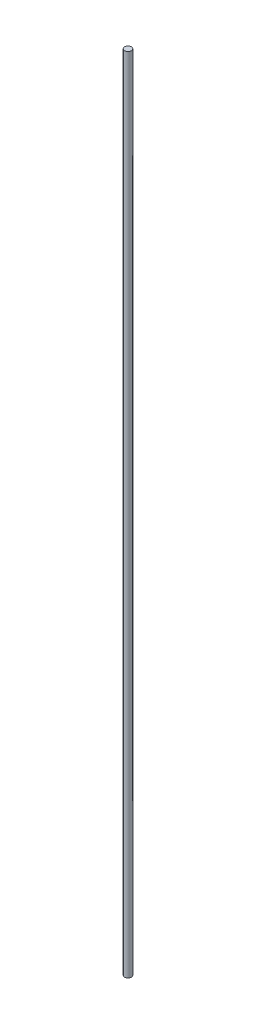
ISO-10303-21;
HEADER;
FILE_DESCRIPTION(('STEP AP214'),'2;1');
FILE_NAME('part.step','',(''),(''),'','','');
FILE_SCHEMA(('AUTOMOTIVE_DESIGN { 1 0 10303 214 1 1 1 1 }'));
ENDSEC;
DATA;
#1=APPLICATION_CONTEXT('core data for automotive mechanical design processes');
#2=APPLICATION_PROTOCOL_DEFINITION('international standard','automotive_design',2000,#1);
#3=PRODUCT_CONTEXT('',#1,'mechanical');
#4=PRODUCT('Part','Part','',(#3));
#5=PRODUCT_RELATED_PRODUCT_CATEGORY('part','',(#4));
#6=PRODUCT_DEFINITION_FORMATION('','',#4);
#7=PRODUCT_DEFINITION_CONTEXT('part definition',#1,'design');
#8=PRODUCT_DEFINITION('design','',#6,#7);
#9=PRODUCT_DEFINITION_SHAPE('','',#8);
#10=(LENGTH_UNIT() NAMED_UNIT(*) SI_UNIT(.MILLI.,.METRE.));
#11=(NAMED_UNIT(*) PLANE_ANGLE_UNIT() SI_UNIT($,.RADIAN.));
#12=(NAMED_UNIT(*) SI_UNIT($,.STERADIAN.) SOLID_ANGLE_UNIT());
#13=UNCERTAINTY_MEASURE_WITH_UNIT(LENGTH_MEASURE(1.E-05),#10,'distance_accuracy_value','');
#14=(GEOMETRIC_REPRESENTATION_CONTEXT(3) GLOBAL_UNCERTAINTY_ASSIGNED_CONTEXT((#13)) GLOBAL_UNIT_ASSIGNED_CONTEXT((#10,
#11,#12)) REPRESENTATION_CONTEXT('',''));
#15=CARTESIAN_POINT('',(0.,0.,0.));
#16=DIRECTION('',(0.,0.,1.));
#17=DIRECTION('',(1.,0.,0.));
#18=AXIS2_PLACEMENT_3D('',#15,#16,#17);
#19=CARTESIAN_POINT('',(0.,1497.33,0.));
#20=DIRECTION('',(0.,-1.,0.));
#21=DIRECTION('',(0.,0.,-1.));
#22=AXIS2_PLACEMENT_3D('',#19,#20,#21);
#23=CYLINDRICAL_SURFACE('',#22,6.35);
#24=CARTESIAN_POINT('',(0.,1497.33,0.));
#25=DIRECTION('',(0.,1.,0.));
#26=DIRECTION('',(0.,0.,1.));
#27=AXIS2_PLACEMENT_3D('',#24,#25,#26);
#28=CIRCLE('',#27,6.35);
#29=CARTESIAN_POINT('',(0.,1497.33,6.35));
#30=VERTEX_POINT('',#29);
#31=EDGE_CURVE('E10',#30,#30,#28,.T.);
#32=ORIENTED_EDGE('',*,*,#31,.F.);
#33=EDGE_LOOP('',(#32));
#34=FACE_BOUND('',#33,.T.);
#35=CARTESIAN_POINT('',(0.,0.,0.));
#36=DIRECTION('',(0.,1.,0.));
#37=DIRECTION('',(0.,0.,1.));
#38=AXIS2_PLACEMENT_3D('',#35,#36,#37);
#39=CIRCLE('',#38,6.35);
#40=CARTESIAN_POINT('',(0.,0.,6.35));
#41=VERTEX_POINT('',#40);
#42=EDGE_CURVE('E48',#41,#41,#39,.T.);
#43=ORIENTED_EDGE('',*,*,#42,.T.);
#44=EDGE_LOOP('',(#43));
#45=FACE_BOUND('',#44,.T.);
#46=ADVANCED_FACE('F44',(#34,#45),#23,.T.);
#47=CARTESIAN_POINT('',(0.,1497.33,0.));
#48=DIRECTION('',(0.,1.,0.));
#49=DIRECTION('',(0.,0.,1.));
#50=AXIS2_PLACEMENT_3D('',#47,#48,#49);
#51=PLANE('',#50);
#52=ORIENTED_EDGE('',*,*,#31,.T.);
#53=EDGE_LOOP('',(#52));
#54=FACE_BOUND('',#53,.T.);
#55=ADVANCED_FACE('F58',(#54),#51,.T.);
#56=CARTESIAN_POINT('',(0.,0.,0.));
#57=DIRECTION('',(0.,1.,0.));
#58=DIRECTION('',(0.,0.,1.));
#59=AXIS2_PLACEMENT_3D('',#56,#57,#58);
#60=PLANE('',#59);
#61=ORIENTED_EDGE('',*,*,#42,.F.);
#62=EDGE_LOOP('',(#61));
#63=FACE_BOUND('',#62,.T.);
#64=ADVANCED_FACE('F59',(#63),#60,.F.);
#65=CLOSED_SHELL('',(#46,#55,#64));
#66=MANIFOLD_SOLID_BREP('B2',#65);
#67=ADVANCED_BREP_SHAPE_REPRESENTATION('',(#18,#66),#14);
#68=SHAPE_DEFINITION_REPRESENTATION(#9,#67);
ENDSEC;
END-ISO-10303-21;
